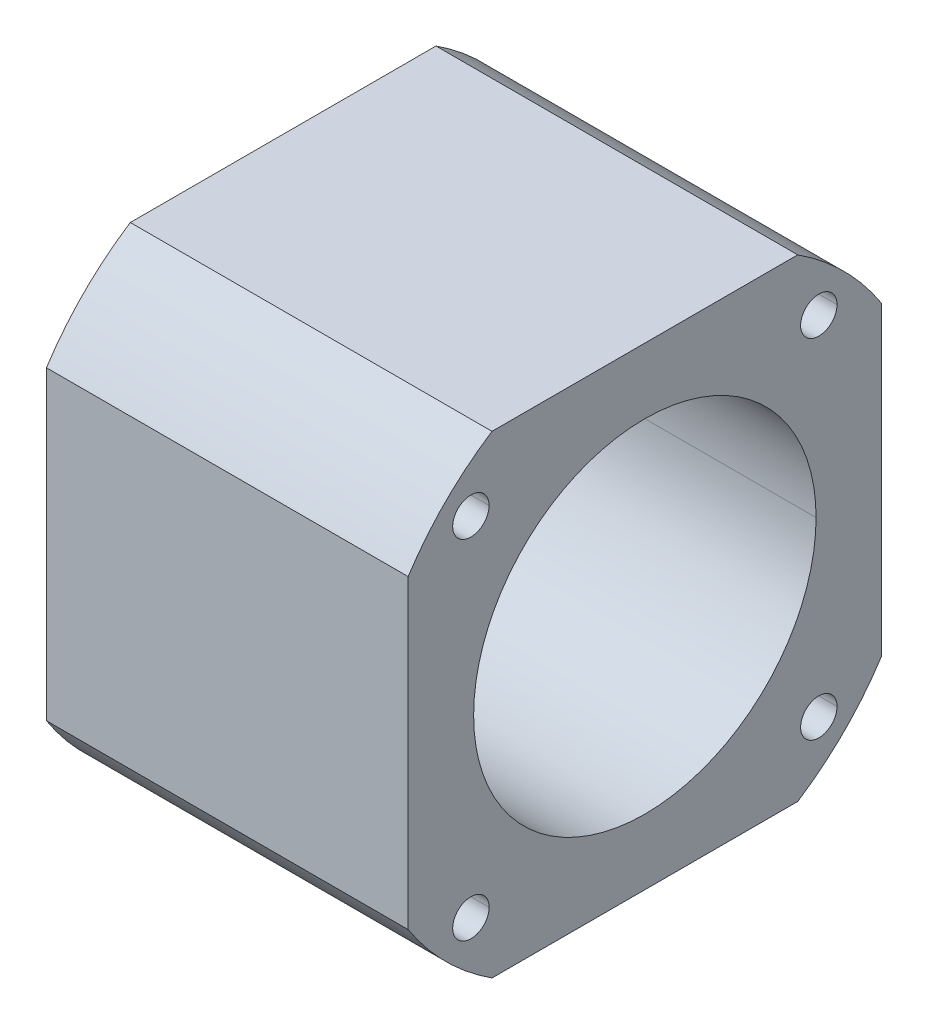
ISO-10303-21;
HEADER;
FILE_DESCRIPTION(('STEP AP214'),'2;1');
FILE_NAME('part.step','',(''),(''),'','','');
FILE_SCHEMA(('AUTOMOTIVE_DESIGN { 1 0 10303 214 1 1 1 1 }'));
ENDSEC;
DATA;
#1=APPLICATION_CONTEXT('core data for automotive mechanical design processes');
#2=APPLICATION_PROTOCOL_DEFINITION('international standard','automotive_design',2000,#1);
#3=PRODUCT_CONTEXT('',#1,'mechanical');
#4=PRODUCT('Part','Part','',(#3));
#5=PRODUCT_RELATED_PRODUCT_CATEGORY('part','',(#4));
#6=PRODUCT_DEFINITION_FORMATION('','',#4);
#7=PRODUCT_DEFINITION_CONTEXT('part definition',#1,'design');
#8=PRODUCT_DEFINITION('design','',#6,#7);
#9=PRODUCT_DEFINITION_SHAPE('','',#8);
#10=(LENGTH_UNIT() NAMED_UNIT(*) SI_UNIT(.MILLI.,.METRE.));
#11=(NAMED_UNIT(*) PLANE_ANGLE_UNIT() SI_UNIT($,.RADIAN.));
#12=(NAMED_UNIT(*) SI_UNIT($,.STERADIAN.) SOLID_ANGLE_UNIT());
#13=UNCERTAINTY_MEASURE_WITH_UNIT(LENGTH_MEASURE(1.E-05),#10,'distance_accuracy_value','');
#14=(GEOMETRIC_REPRESENTATION_CONTEXT(3) GLOBAL_UNCERTAINTY_ASSIGNED_CONTEXT((#13)) GLOBAL_UNIT_ASSIGNED_CONTEXT((#10,
#11,#12)) REPRESENTATION_CONTEXT('',''));
#15=CARTESIAN_POINT('',(0.,0.,0.));
#16=DIRECTION('',(0.,0.,1.));
#17=DIRECTION('',(1.,0.,0.));
#18=AXIS2_PLACEMENT_3D('',#15,#16,#17);
#19=CARTESIAN_POINT('',(21.1074,2.05287176147095E-11,2.05321870616615E-11));
#20=DIRECTION('',(1.,0.,0.));
#21=DIRECTION('',(0.,-0.707106781186548,-0.707106781186547));
#22=AXIS2_PLACEMENT_3D('',#19,#20,#21);
#23=CYLINDRICAL_SURFACE('',#22,25.0951999999714);
#24=CARTESIAN_POINT('',(11.1074,2.05287176147095E-11,2.05321870616615E-11));
#25=DIRECTION('',(-1.,0.,0.));
#26=DIRECTION('',(0.,-1.,0.));
#27=AXIS2_PLACEMENT_3D('',#24,#25,#26);
#28=CIRCLE('',#27,25.0951999999714);
#29=CARTESIAN_POINT('',(11.1074,21.082,13.613167854691));
#30=VERTEX_POINT('',#29);
#31=CARTESIAN_POINT('',(11.1074,13.613167854691,21.082));
#32=VERTEX_POINT('',#31);
#33=EDGE_CURVE('E51',#30,#32,#28,.F.);
#34=ORIENTED_EDGE('',*,*,#33,.F.);
#35=DIRECTION('',(-1.,0.,0.));
#36=VECTOR('',#35,1.);
#37=CARTESIAN_POINT('',(21.1074,21.082,13.613167854691));
#38=LINE('',#37,#36);
#39=CARTESIAN_POINT('',(-21.1074,21.082,13.613167854691));
#40=VERTEX_POINT('',#39);
#41=EDGE_CURVE('E37',#30,#40,#38,.T.);
#42=ORIENTED_EDGE('',*,*,#41,.T.);
#43=CARTESIAN_POINT('',(-21.1074,2.05287176147095E-11,2.05321870616615E-11));
#44=DIRECTION('',(1.,0.,0.));
#45=DIRECTION('',(0.,0.,-1.));
#46=AXIS2_PLACEMENT_3D('',#43,#44,#45);
#47=CIRCLE('',#46,25.0951999999714);
#48=CARTESIAN_POINT('',(-21.1074,13.613167854691,21.082));
#49=VERTEX_POINT('',#48);
#50=EDGE_CURVE('E43',#40,#49,#47,.T.);
#51=ORIENTED_EDGE('',*,*,#50,.T.);
#52=DIRECTION('',(-1.,0.,0.));
#53=VECTOR('',#52,1.);
#54=CARTESIAN_POINT('',(21.1074,13.613167854691,21.082));
#55=LINE('',#54,#53);
#56=EDGE_CURVE('E253',#32,#49,#55,.T.);
#57=ORIENTED_EDGE('',*,*,#56,.F.);
#58=EDGE_LOOP('',(#34,#42,#51,#57));
#59=FACE_BOUND('',#58,.T.);
#60=ADVANCED_FACE('F34',(#59),#23,.T.);
#61=CARTESIAN_POINT('',(21.1074,21.082,-13.613167854691));
#62=DIRECTION('',(0.,-1.,0.));
#63=DIRECTION('',(0.,0.,-1.));
#64=AXIS2_PLACEMENT_3D('',#61,#62,#63);
#65=PLANE('',#64);
#66=ORIENTED_EDGE('',*,*,#41,.F.);
#67=DIRECTION('',(0.,0.,1.));
#68=VECTOR('',#67,1.);
#69=CARTESIAN_POINT('',(11.1074,21.082,-21.08205));
#70=LINE('',#69,#68);
#71=CARTESIAN_POINT('',(11.1074,21.082,-13.613167854691));
#72=VERTEX_POINT('',#71);
#73=EDGE_CURVE('E195',#72,#30,#70,.T.);
#74=ORIENTED_EDGE('',*,*,#73,.F.);
#75=DIRECTION('',(-1.,0.,0.));
#76=VECTOR('',#75,1.);
#77=CARTESIAN_POINT('',(21.1074,21.082,-13.613167854691));
#78=LINE('',#77,#76);
#79=CARTESIAN_POINT('',(-21.1074,21.082,-13.613167854691));
#80=VERTEX_POINT('',#79);
#81=EDGE_CURVE('E239',#72,#80,#78,.T.);
#82=ORIENTED_EDGE('',*,*,#81,.T.);
#83=DIRECTION('',(0.,0.,1.));
#84=VECTOR('',#83,1.);
#85=CARTESIAN_POINT('',(-21.1074,21.082,-13.613167854691));
#86=LINE('',#85,#84);
#87=EDGE_CURVE('E241',#80,#40,#86,.T.);
#88=ORIENTED_EDGE('',*,*,#87,.T.);
#89=EDGE_LOOP('',(#66,#74,#82,#88));
#90=FACE_BOUND('',#89,.T.);
#91=ADVANCED_FACE('F810',(#90),#65,.F.);
#92=CARTESIAN_POINT('',(21.1074,2.05321870616615E-11,-2.05287176147095E-11));
#93=DIRECTION('',(1.,0.,0.));
#94=DIRECTION('',(0.,-0.707106781186547,0.707106781186548));
#95=AXIS2_PLACEMENT_3D('',#92,#93,#94);
#96=CYLINDRICAL_SURFACE('',#95,25.0951999999714);
#97=CARTESIAN_POINT('',(11.1074,2.05321870616615E-11,-2.05287176147095E-11));
#98=DIRECTION('',(-1.,0.,0.));
#99=DIRECTION('',(0.,-1.,0.));
#100=AXIS2_PLACEMENT_3D('',#97,#98,#99);
#101=CIRCLE('',#100,25.0951999999714);
#102=CARTESIAN_POINT('',(11.1074,13.613167854691,-21.082));
#103=VERTEX_POINT('',#102);
#104=EDGE_CURVE('E296',#103,#72,#101,.F.);
#105=ORIENTED_EDGE('',*,*,#104,.F.);
#106=DIRECTION('',(-1.,0.,0.));
#107=VECTOR('',#106,1.);
#108=CARTESIAN_POINT('',(21.1074,13.613167854691,-21.082));
#109=LINE('',#108,#107);
#110=CARTESIAN_POINT('',(-21.1074,13.613167854691,-21.082));
#111=VERTEX_POINT('',#110);
#112=EDGE_CURVE('E232',#103,#111,#109,.T.);
#113=ORIENTED_EDGE('',*,*,#112,.T.);
#114=CARTESIAN_POINT('',(-21.1074,2.05321870616615E-11,-2.05287176147095E-11));
#115=DIRECTION('',(1.,0.,0.));
#116=DIRECTION('',(0.,0.,-1.));
#117=AXIS2_PLACEMENT_3D('',#114,#115,#116);
#118=CIRCLE('',#117,25.0951999999714);
#119=EDGE_CURVE('E237',#111,#80,#118,.T.);
#120=ORIENTED_EDGE('',*,*,#119,.T.);
#121=ORIENTED_EDGE('',*,*,#81,.F.);
#122=EDGE_LOOP('',(#105,#113,#120,#121));
#123=FACE_BOUND('',#122,.T.);
#124=ADVANCED_FACE('F815',(#123),#96,.T.);
#125=CARTESIAN_POINT('',(21.1074,-13.613167854691,-21.082));
#126=DIRECTION('',(0.,0.,1.));
#127=DIRECTION('',(1.,0.,0.));
#128=AXIS2_PLACEMENT_3D('',#125,#126,#127);
#129=PLANE('',#128);
#130=ORIENTED_EDGE('',*,*,#112,.F.);
#131=DIRECTION('',(0.,-1.,0.));
#132=VECTOR('',#131,1.);
#133=CARTESIAN_POINT('',(11.1074,-13.613167854691,-21.082));
#134=LINE('',#133,#132);
#135=CARTESIAN_POINT('',(11.1074,-13.613167854691,-21.082));
#136=VERTEX_POINT('',#135);
#137=EDGE_CURVE('E204',#103,#136,#134,.T.);
#138=ORIENTED_EDGE('',*,*,#137,.T.);
#139=DIRECTION('',(-1.,0.,0.));
#140=VECTOR('',#139,1.);
#141=CARTESIAN_POINT('',(21.1074,-13.613167854691,-21.082));
#142=LINE('',#141,#140);
#143=CARTESIAN_POINT('',(-21.1074,-13.613167854691,-21.082));
#144=VERTEX_POINT('',#143);
#145=EDGE_CURVE('E203',#136,#144,#142,.T.);
#146=ORIENTED_EDGE('',*,*,#145,.T.);
#147=DIRECTION('',(0.,1.,0.));
#148=VECTOR('',#147,1.);
#149=CARTESIAN_POINT('',(-21.1074,-13.613167854691,-21.082));
#150=LINE('',#149,#148);
#151=EDGE_CURVE('E229',#144,#111,#150,.T.);
#152=ORIENTED_EDGE('',*,*,#151,.T.);
#153=EDGE_LOOP('',(#130,#138,#146,#152));
#154=FACE_BOUND('',#153,.T.);
#155=ADVANCED_FACE('F294',(#154),#129,.F.);
#156=CARTESIAN_POINT('',(21.1074,-2.05287176147095E-11,-2.05321870616615E-11));
#157=DIRECTION('',(1.,0.,0.));
#158=DIRECTION('',(0.,0.707106781186547,0.707106781186548));
#159=AXIS2_PLACEMENT_3D('',#156,#157,#158);
#160=CYLINDRICAL_SURFACE('',#159,25.0951999999714);
#161=CARTESIAN_POINT('',(11.1074,-2.05287176147095E-11,-2.05321870616615E-11));
#162=DIRECTION('',(-1.,0.,0.));
#163=DIRECTION('',(0.,-1.,0.));
#164=AXIS2_PLACEMENT_3D('',#161,#162,#163);
#165=CIRCLE('',#164,25.0951999999714);
#166=CARTESIAN_POINT('',(11.1074,-21.082,-13.613167854691));
#167=VERTEX_POINT('',#166);
#168=EDGE_CURVE('E187',#167,#136,#165,.F.);
#169=ORIENTED_EDGE('',*,*,#168,.F.);
#170=DIRECTION('',(-1.,0.,0.));
#171=VECTOR('',#170,1.);
#172=CARTESIAN_POINT('',(21.1074,-21.082,-13.613167854691));
#173=LINE('',#172,#171);
#174=CARTESIAN_POINT('',(-21.1074,-21.082,-13.613167854691));
#175=VERTEX_POINT('',#174);
#176=EDGE_CURVE('E201',#167,#175,#173,.T.);
#177=ORIENTED_EDGE('',*,*,#176,.T.);
#178=CARTESIAN_POINT('',(-21.1074,-2.05287176147095E-11,-2.05321870616615E-11));
#179=DIRECTION('',(1.,0.,0.));
#180=DIRECTION('',(0.,0.,-1.));
#181=AXIS2_PLACEMENT_3D('',#178,#179,#180);
#182=CIRCLE('',#181,25.0951999999714);
#183=EDGE_CURVE('E210',#175,#144,#182,.T.);
#184=ORIENTED_EDGE('',*,*,#183,.T.);
#185=ORIENTED_EDGE('',*,*,#145,.F.);
#186=EDGE_LOOP('',(#169,#177,#184,#185));
#187=FACE_BOUND('',#186,.T.);
#188=ADVANCED_FACE('F199',(#187),#160,.T.);
#189=CARTESIAN_POINT('',(21.1074,-21.082,13.613167854691));
#190=DIRECTION('',(0.,1.,0.));
#191=DIRECTION('',(0.,0.,1.));
#192=AXIS2_PLACEMENT_3D('',#189,#190,#191);
#193=PLANE('',#192);
#194=ORIENTED_EDGE('',*,*,#176,.F.);
#195=DIRECTION('',(0.,0.,1.));
#196=VECTOR('',#195,1.);
#197=CARTESIAN_POINT('',(11.1074,-21.082,-21.08205));
#198=LINE('',#197,#196);
#199=CARTESIAN_POINT('',(11.1074,-21.082,13.613167854691));
#200=VERTEX_POINT('',#199);
#201=EDGE_CURVE('E183',#167,#200,#198,.T.);
#202=ORIENTED_EDGE('',*,*,#201,.T.);
#203=DIRECTION('',(-1.,0.,0.));
#204=VECTOR('',#203,1.);
#205=CARTESIAN_POINT('',(21.1074,-21.082,13.613167854691));
#206=LINE('',#205,#204);
#207=CARTESIAN_POINT('',(-21.1074,-21.082,13.613167854691));
#208=VERTEX_POINT('',#207);
#209=EDGE_CURVE('E213',#200,#208,#206,.T.);
#210=ORIENTED_EDGE('',*,*,#209,.T.);
#211=DIRECTION('',(0.,0.,-1.));
#212=VECTOR('',#211,1.);
#213=CARTESIAN_POINT('',(-21.1074,-21.082,13.613167854691));
#214=LINE('',#213,#212);
#215=EDGE_CURVE('E208',#208,#175,#214,.T.);
#216=ORIENTED_EDGE('',*,*,#215,.T.);
#217=EDGE_LOOP('',(#194,#202,#210,#216));
#218=FACE_BOUND('',#217,.T.);
#219=ADVANCED_FACE('F206',(#218),#193,.F.);
#220=CARTESIAN_POINT('',(21.1074,-2.05321870616615E-11,2.05287176147095E-11));
#221=DIRECTION('',(1.,0.,0.));
#222=DIRECTION('',(0.,0.707106781186548,-0.707106781186547));
#223=AXIS2_PLACEMENT_3D('',#220,#221,#222);
#224=CYLINDRICAL_SURFACE('',#223,25.0951999999714);
#225=CARTESIAN_POINT('',(11.1074,-2.05321870616615E-11,2.05287176147095E-11));
#226=DIRECTION('',(-1.,0.,0.));
#227=DIRECTION('',(0.,-1.,0.));
#228=AXIS2_PLACEMENT_3D('',#225,#226,#227);
#229=CIRCLE('',#228,25.0951999999714);
#230=CARTESIAN_POINT('',(11.1074,-13.613167854691,21.082));
#231=VERTEX_POINT('',#230);
#232=EDGE_CURVE('E190',#231,#200,#229,.F.);
#233=ORIENTED_EDGE('',*,*,#232,.F.);
#234=DIRECTION('',(-1.,0.,0.));
#235=VECTOR('',#234,1.);
#236=CARTESIAN_POINT('',(21.1074,-13.613167854691,21.082));
#237=LINE('',#236,#235);
#238=CARTESIAN_POINT('',(-21.1074,-13.613167854691,21.082));
#239=VERTEX_POINT('',#238);
#240=EDGE_CURVE('E255',#231,#239,#237,.T.);
#241=ORIENTED_EDGE('',*,*,#240,.T.);
#242=CARTESIAN_POINT('',(-21.1074,-2.05321870616615E-11,2.05287176147095E-11));
#243=DIRECTION('',(1.,0.,0.));
#244=DIRECTION('',(0.,0.,-1.));
#245=AXIS2_PLACEMENT_3D('',#242,#243,#244);
#246=CIRCLE('',#245,25.0951999999714);
#247=EDGE_CURVE('E258',#239,#208,#246,.T.);
#248=ORIENTED_EDGE('',*,*,#247,.T.);
#249=ORIENTED_EDGE('',*,*,#209,.F.);
#250=EDGE_LOOP('',(#233,#241,#248,#249));
#251=FACE_BOUND('',#250,.T.);
#252=ADVANCED_FACE('F274',(#251),#224,.T.);
#253=CARTESIAN_POINT('',(21.1074,13.613167854691,21.082));
#254=DIRECTION('',(0.,0.,-1.));
#255=DIRECTION('',(-1.,0.,0.));
#256=AXIS2_PLACEMENT_3D('',#253,#254,#255);
#257=PLANE('',#256);
#258=ORIENTED_EDGE('',*,*,#240,.F.);
#259=DIRECTION('',(0.,1.,0.));
#260=VECTOR('',#259,1.);
#261=CARTESIAN_POINT('',(11.1074,13.613167854691,21.082));
#262=LINE('',#261,#260);
#263=EDGE_CURVE('E277',#231,#32,#262,.T.);
#264=ORIENTED_EDGE('',*,*,#263,.T.);
#265=ORIENTED_EDGE('',*,*,#56,.T.);
#266=DIRECTION('',(0.,-1.,0.));
#267=VECTOR('',#266,1.);
#268=CARTESIAN_POINT('',(-21.1074,13.613167854691,21.082));
#269=LINE('',#268,#267);
#270=EDGE_CURVE('E259',#49,#239,#269,.T.);
#271=ORIENTED_EDGE('',*,*,#270,.T.);
#272=EDGE_LOOP('',(#258,#264,#265,#271));
#273=FACE_BOUND('',#272,.T.);
#274=ADVANCED_FACE('F280',(#273),#257,.F.);
#275=CARTESIAN_POINT('',(-21.1074,-2.05321870616615E-11,2.05287176147095E-11));
#276=DIRECTION('',(1.,0.,0.));
#277=DIRECTION('',(0.,0.,-1.));
#278=AXIS2_PLACEMENT_3D('',#275,#276,#277);
#279=PLANE('',#278);
#280=CARTESIAN_POINT('',(-21.1074,15.494,-15.494));
#281=DIRECTION('',(1.,0.,0.));
#282=DIRECTION('',(0.,0.,-1.));
#283=AXIS2_PLACEMENT_3D('',#280,#281,#282);
#284=CIRCLE('',#283,2.);
#285=CARTESIAN_POINT('',(-21.1074,15.494,-17.494));
#286=VERTEX_POINT('',#285);
#287=CARTESIAN_POINT('',(-21.1074,15.494,-13.494));
#288=VERTEX_POINT('',#287);
#289=EDGE_CURVE('E286',#286,#288,#284,.T.);
#290=ORIENTED_EDGE('',*,*,#289,.T.);
#291=CARTESIAN_POINT('',(-21.1074,15.494,-15.494));
#292=DIRECTION('',(1.,0.,0.));
#293=DIRECTION('',(0.,0.,-1.));
#294=AXIS2_PLACEMENT_3D('',#291,#292,#293);
#295=CIRCLE('',#294,2.);
#296=EDGE_CURVE('E653',#288,#286,#295,.T.);
#297=ORIENTED_EDGE('',*,*,#296,.T.);
#298=EDGE_LOOP('',(#290,#297));
#299=FACE_BOUND('',#298,.T.);
#300=CARTESIAN_POINT('',(-21.1074,15.494,15.494));
#301=DIRECTION('',(1.,0.,0.));
#302=DIRECTION('',(0.,0.,-1.));
#303=AXIS2_PLACEMENT_3D('',#300,#301,#302);
#304=CIRCLE('',#303,2.);
#305=CARTESIAN_POINT('',(-21.1074,15.494,13.494));
#306=VERTEX_POINT('',#305);
#307=CARTESIAN_POINT('',(-21.1074,15.494,17.494));
#308=VERTEX_POINT('',#307);
#309=EDGE_CURVE('E649',#306,#308,#304,.T.);
#310=ORIENTED_EDGE('',*,*,#309,.T.);
#311=CARTESIAN_POINT('',(-21.1074,15.494,15.494));
#312=DIRECTION('',(1.,0.,0.));
#313=DIRECTION('',(0.,0.,-1.));
#314=AXIS2_PLACEMENT_3D('',#311,#312,#313);
#315=CIRCLE('',#314,2.);
#316=EDGE_CURVE('E645',#308,#306,#315,.T.);
#317=ORIENTED_EDGE('',*,*,#316,.T.);
#318=EDGE_LOOP('',(#310,#317));
#319=FACE_BOUND('',#318,.T.);
#320=CARTESIAN_POINT('',(-21.1074,-15.494,-15.494));
#321=DIRECTION('',(1.,0.,0.));
#322=DIRECTION('',(0.,0.,-1.));
#323=AXIS2_PLACEMENT_3D('',#320,#321,#322);
#324=CIRCLE('',#323,2.);
#325=CARTESIAN_POINT('',(-21.1074,-15.494,-17.494));
#326=VERTEX_POINT('',#325);
#327=CARTESIAN_POINT('',(-21.1074,-15.494,-13.494));
#328=VERTEX_POINT('',#327);
#329=EDGE_CURVE('E641',#326,#328,#324,.T.);
#330=ORIENTED_EDGE('',*,*,#329,.T.);
#331=CARTESIAN_POINT('',(-21.1074,-15.494,-15.494));
#332=DIRECTION('',(1.,0.,0.));
#333=DIRECTION('',(0.,0.,-1.));
#334=AXIS2_PLACEMENT_3D('',#331,#332,#333);
#335=CIRCLE('',#334,2.);
#336=EDGE_CURVE('E637',#328,#326,#335,.T.);
#337=ORIENTED_EDGE('',*,*,#336,.T.);
#338=EDGE_LOOP('',(#330,#337));
#339=FACE_BOUND('',#338,.T.);
#340=CARTESIAN_POINT('',(-21.1074,-15.494,15.494));
#341=DIRECTION('',(1.,0.,0.));
#342=DIRECTION('',(0.,0.,-1.));
#343=AXIS2_PLACEMENT_3D('',#340,#341,#342);
#344=CIRCLE('',#343,2.);
#345=CARTESIAN_POINT('',(-21.1074,-15.494,13.494));
#346=VERTEX_POINT('',#345);
#347=CARTESIAN_POINT('',(-21.1074,-15.494,17.494));
#348=VERTEX_POINT('',#347);
#349=EDGE_CURVE('E633',#346,#348,#344,.T.);
#350=ORIENTED_EDGE('',*,*,#349,.T.);
#351=CARTESIAN_POINT('',(-21.1074,-15.494,15.494));
#352=DIRECTION('',(1.,0.,0.));
#353=DIRECTION('',(0.,0.,-1.));
#354=AXIS2_PLACEMENT_3D('',#351,#352,#353);
#355=CIRCLE('',#354,2.);
#356=EDGE_CURVE('E629',#348,#346,#355,.T.);
#357=ORIENTED_EDGE('',*,*,#356,.T.);
#358=EDGE_LOOP('',(#350,#357));
#359=FACE_BOUND('',#358,.T.);
#360=CARTESIAN_POINT('',(-21.1074,0.,0.));
#361=DIRECTION('',(1.,0.,0.));
#362=DIRECTION('',(0.,0.,-1.));
#363=AXIS2_PLACEMENT_3D('',#360,#361,#362);
#364=CIRCLE('',#363,15.25);
#365=CARTESIAN_POINT('',(-21.1074,0.,-15.25));
#366=VERTEX_POINT('',#365);
#367=CARTESIAN_POINT('',(-21.1074,0.,15.25));
#368=VERTEX_POINT('',#367);
#369=EDGE_CURVE('E625',#366,#368,#364,.T.);
#370=ORIENTED_EDGE('',*,*,#369,.T.);
#371=CARTESIAN_POINT('',(-21.1074,0.,0.));
#372=DIRECTION('',(1.,0.,0.));
#373=DIRECTION('',(0.,0.,-1.));
#374=AXIS2_PLACEMENT_3D('',#371,#372,#373);
#375=CIRCLE('',#374,15.25);
#376=EDGE_CURVE('E623',#368,#366,#375,.T.);
#377=ORIENTED_EDGE('',*,*,#376,.T.);
#378=EDGE_LOOP('',(#370,#377));
#379=FACE_BOUND('',#378,.T.);
#380=ORIENTED_EDGE('',*,*,#270,.F.);
#381=ORIENTED_EDGE('',*,*,#50,.F.);
#382=ORIENTED_EDGE('',*,*,#87,.F.);
#383=ORIENTED_EDGE('',*,*,#119,.F.);
#384=ORIENTED_EDGE('',*,*,#151,.F.);
#385=ORIENTED_EDGE('',*,*,#183,.F.);
#386=ORIENTED_EDGE('',*,*,#215,.F.);
#387=ORIENTED_EDGE('',*,*,#247,.F.);
#388=EDGE_LOOP('',(#380,#381,#382,#383,#384,#385,#386,#387));
#389=FACE_BOUND('',#388,.T.);
#390=ADVANCED_FACE('F287',(#299,#319,#339,#359,#379,#389),#279,.F.);
#391=CARTESIAN_POINT('',(21.1074,0.,0.));
#392=DIRECTION('',(1.,0.,0.));
#393=DIRECTION('',(0.,1.,0.));
#394=AXIS2_PLACEMENT_3D('',#391,#392,#393);
#395=CYLINDRICAL_SURFACE('',#394,15.25);
#396=CARTESIAN_POINT('',(-21.1074,0.,15.25));
#397=DIRECTION('',(1.,0.,0.));
#398=VECTOR('',#397,1.);
#399=LINE('',#396,#398);
#400=CARTESIAN_POINT('',(11.1074,0.,15.25));
#401=VERTEX_POINT('',#400);
#402=EDGE_CURVE('E600',#368,#401,#399,.T.);
#403=ORIENTED_EDGE('',*,*,#402,.T.);
#404=CARTESIAN_POINT('',(11.1074,0.,0.));
#405=DIRECTION('',(-1.,0.,0.));
#406=DIRECTION('',(0.,-1.,0.));
#407=AXIS2_PLACEMENT_3D('',#404,#405,#406);
#408=CIRCLE('',#407,15.25);
#409=CARTESIAN_POINT('',(11.1074,0.,-15.25));
#410=VERTEX_POINT('',#409);
#411=EDGE_CURVE('E58',#401,#410,#408,.F.);
#412=ORIENTED_EDGE('',*,*,#411,.T.);
#413=CARTESIAN_POINT('',(-21.1074,0.,-15.25));
#414=DIRECTION('',(1.,0.,0.));
#415=VECTOR('',#414,1.);
#416=LINE('',#413,#415);
#417=EDGE_CURVE('E613',#366,#410,#416,.T.);
#418=ORIENTED_EDGE('',*,*,#417,.F.);
#419=ORIENTED_EDGE('',*,*,#376,.F.);
#420=EDGE_LOOP('',(#403,#412,#418,#419));
#421=FACE_BOUND('',#420,.T.);
#422=ADVANCED_FACE('F583',(#421),#395,.F.);
#423=CARTESIAN_POINT('',(21.1074,0.,0.));
#424=DIRECTION('',(1.,0.,0.));
#425=DIRECTION('',(0.,-1.,0.));
#426=AXIS2_PLACEMENT_3D('',#423,#424,#425);
#427=CYLINDRICAL_SURFACE('',#426,15.25);
#428=ORIENTED_EDGE('',*,*,#417,.T.);
#429=CARTESIAN_POINT('',(11.1074,0.,0.));
#430=DIRECTION('',(-1.,0.,0.));
#431=DIRECTION('',(0.,-1.,0.));
#432=AXIS2_PLACEMENT_3D('',#429,#430,#431);
#433=CIRCLE('',#432,15.25);
#434=EDGE_CURVE('E846',#410,#401,#433,.F.);
#435=ORIENTED_EDGE('',*,*,#434,.T.);
#436=ORIENTED_EDGE('',*,*,#402,.F.);
#437=ORIENTED_EDGE('',*,*,#369,.F.);
#438=EDGE_LOOP('',(#428,#435,#436,#437));
#439=FACE_BOUND('',#438,.T.);
#440=ADVANCED_FACE('F574',(#439),#427,.F.);
#441=CARTESIAN_POINT('',(-21.1074,-15.494,15.494));
#442=DIRECTION('',(-1.,0.,0.));
#443=DIRECTION('',(0.,1.,0.));
#444=AXIS2_PLACEMENT_3D('',#441,#442,#443);
#445=CONICAL_SURFACE('',#444,2.,0.785398163397451);
#446=ORIENTED_EDGE('',*,*,#356,.F.);
#447=CARTESIAN_POINT('',(-20.7284,-15.494,17.115));
#448=DIRECTION('',(-0.707106781186544,0.,0.707106781186551));
#449=VECTOR('',#448,1.);
#450=LINE('',#447,#449);
#451=CARTESIAN_POINT('',(-20.7284,-15.494,17.115));
#452=VERTEX_POINT('',#451);
#453=EDGE_CURVE('E537',#452,#348,#450,.T.);
#454=ORIENTED_EDGE('',*,*,#453,.F.);
#455=CARTESIAN_POINT('',(-20.7284,-15.494,15.494));
#456=DIRECTION('',(1.,0.,0.));
#457=DIRECTION('',(0.,0.,-1.));
#458=AXIS2_PLACEMENT_3D('',#455,#456,#457);
#459=CIRCLE('',#458,1.621);
#460=CARTESIAN_POINT('',(-20.7284,-15.494,13.873));
#461=VERTEX_POINT('',#460);
#462=EDGE_CURVE('E556',#452,#461,#459,.T.);
#463=ORIENTED_EDGE('',*,*,#462,.T.);
#464=CARTESIAN_POINT('',(-20.7284,-15.494,13.873));
#465=DIRECTION('',(-0.707106781186544,0.,-0.707106781186551));
#466=VECTOR('',#465,1.);
#467=LINE('',#464,#466);
#468=EDGE_CURVE('E540',#461,#346,#467,.T.);
#469=ORIENTED_EDGE('',*,*,#468,.T.);
#470=EDGE_LOOP('',(#446,#454,#463,#469));
#471=FACE_BOUND('',#470,.T.);
#472=ADVANCED_FACE('F518',(#471),#445,.F.);
#473=CARTESIAN_POINT('',(-21.1074,-15.494,15.494));
#474=DIRECTION('',(-1.,0.,0.));
#475=DIRECTION('',(0.,-1.,0.));
#476=AXIS2_PLACEMENT_3D('',#473,#474,#475);
#477=CONICAL_SURFACE('',#476,2.,0.785398163397451);
#478=CARTESIAN_POINT('',(-20.7284,-15.494,15.494));
#479=DIRECTION('',(1.,0.,0.));
#480=DIRECTION('',(0.,0.,-1.));
#481=AXIS2_PLACEMENT_3D('',#478,#479,#480);
#482=CIRCLE('',#481,1.621);
#483=EDGE_CURVE('E538',#461,#452,#482,.T.);
#484=ORIENTED_EDGE('',*,*,#483,.T.);
#485=ORIENTED_EDGE('',*,*,#453,.T.);
#486=ORIENTED_EDGE('',*,*,#349,.F.);
#487=ORIENTED_EDGE('',*,*,#468,.F.);
#488=EDGE_LOOP('',(#484,#485,#486,#487));
#489=FACE_BOUND('',#488,.T.);
#490=ADVANCED_FACE('F512',(#489),#477,.F.);
#491=CARTESIAN_POINT('',(21.1074,-15.494,15.494));
#492=DIRECTION('',(-1.,0.,0.));
#493=DIRECTION('',(0.,-1.,0.));
#494=AXIS2_PLACEMENT_3D('',#491,#492,#493);
#495=CYLINDRICAL_SURFACE('',#494,1.621);
#496=CARTESIAN_POINT('',(11.1074,-15.494,13.873));
#497=DIRECTION('',(-1.,0.,0.));
#498=VECTOR('',#497,1.);
#499=LINE('',#496,#498);
#500=CARTESIAN_POINT('',(11.1074,-15.494,13.873));
#501=VERTEX_POINT('',#500);
#502=EDGE_CURVE('E801',#501,#461,#499,.T.);
#503=ORIENTED_EDGE('',*,*,#502,.F.);
#504=CARTESIAN_POINT('',(11.1074,-15.494,15.494));
#505=DIRECTION('',(-1.,0.,0.));
#506=DIRECTION('',(0.,-1.,0.));
#507=AXIS2_PLACEMENT_3D('',#504,#505,#506);
#508=CIRCLE('',#507,1.621);
#509=CARTESIAN_POINT('',(11.1074,-15.494,17.115));
#510=VERTEX_POINT('',#509);
#511=EDGE_CURVE('E842',#501,#510,#508,.F.);
#512=ORIENTED_EDGE('',*,*,#511,.T.);
#513=CARTESIAN_POINT('',(11.1074,-15.494,17.115));
#514=DIRECTION('',(-1.,0.,0.));
#515=VECTOR('',#514,1.);
#516=LINE('',#513,#515);
#517=EDGE_CURVE('E489',#510,#452,#516,.T.);
#518=ORIENTED_EDGE('',*,*,#517,.T.);
#519=ORIENTED_EDGE('',*,*,#483,.F.);
#520=EDGE_LOOP('',(#503,#512,#518,#519));
#521=FACE_BOUND('',#520,.T.);
#522=ADVANCED_FACE('F502',(#521),#495,.F.);
#523=CARTESIAN_POINT('',(21.1074,-15.494,15.494));
#524=DIRECTION('',(-1.,0.,0.));
#525=DIRECTION('',(0.,1.,0.));
#526=AXIS2_PLACEMENT_3D('',#523,#524,#525);
#527=CYLINDRICAL_SURFACE('',#526,1.621);
#528=ORIENTED_EDGE('',*,*,#517,.F.);
#529=CARTESIAN_POINT('',(11.1074,-15.494,15.494));
#530=DIRECTION('',(-1.,0.,0.));
#531=DIRECTION('',(0.,-1.,0.));
#532=AXIS2_PLACEMENT_3D('',#529,#530,#531);
#533=CIRCLE('',#532,1.621);
#534=EDGE_CURVE('E802',#510,#501,#533,.F.);
#535=ORIENTED_EDGE('',*,*,#534,.T.);
#536=ORIENTED_EDGE('',*,*,#502,.T.);
#537=ORIENTED_EDGE('',*,*,#462,.F.);
#538=EDGE_LOOP('',(#528,#535,#536,#537));
#539=FACE_BOUND('',#538,.T.);
#540=ADVANCED_FACE('F511',(#539),#527,.F.);
#541=CARTESIAN_POINT('',(-21.1074,-15.494,-15.494));
#542=DIRECTION('',(-1.,0.,0.));
#543=DIRECTION('',(0.,1.,0.));
#544=AXIS2_PLACEMENT_3D('',#541,#542,#543);
#545=CONICAL_SURFACE('',#544,2.,0.785398163397451);
#546=ORIENTED_EDGE('',*,*,#336,.F.);
#547=CARTESIAN_POINT('',(-20.7284,-15.494,-13.873));
#548=DIRECTION('',(-0.707106781186544,0.,0.707106781186551));
#549=VECTOR('',#548,1.);
#550=LINE('',#547,#549);
#551=CARTESIAN_POINT('',(-20.7284,-15.494,-13.873));
#552=VERTEX_POINT('',#551);
#553=EDGE_CURVE('E749',#552,#328,#550,.T.);
#554=ORIENTED_EDGE('',*,*,#553,.F.);
#555=CARTESIAN_POINT('',(-20.7284,-15.494,-15.494));
#556=DIRECTION('',(1.,0.,0.));
#557=DIRECTION('',(0.,0.,-1.));
#558=AXIS2_PLACEMENT_3D('',#555,#556,#557);
#559=CIRCLE('',#558,1.621);
#560=CARTESIAN_POINT('',(-20.7284,-15.494,-17.115));
#561=VERTEX_POINT('',#560);
#562=EDGE_CURVE('E736',#552,#561,#559,.T.);
#563=ORIENTED_EDGE('',*,*,#562,.T.);
#564=CARTESIAN_POINT('',(-20.7284,-15.494,-17.115));
#565=DIRECTION('',(-0.707106781186544,0.,-0.707106781186551));
#566=VECTOR('',#565,1.);
#567=LINE('',#564,#566);
#568=EDGE_CURVE('E739',#561,#326,#567,.T.);
#569=ORIENTED_EDGE('',*,*,#568,.T.);
#570=EDGE_LOOP('',(#546,#554,#563,#569));
#571=FACE_BOUND('',#570,.T.);
#572=ADVANCED_FACE('F745',(#571),#545,.F.);
#573=CARTESIAN_POINT('',(-21.1074,-15.494,-15.494));
#574=DIRECTION('',(-1.,0.,0.));
#575=DIRECTION('',(0.,-1.,0.));
#576=AXIS2_PLACEMENT_3D('',#573,#574,#575);
#577=CONICAL_SURFACE('',#576,2.,0.785398163397451);
#578=CARTESIAN_POINT('',(-20.7284,-15.494,-15.494));
#579=DIRECTION('',(1.,0.,0.));
#580=DIRECTION('',(0.,0.,-1.));
#581=AXIS2_PLACEMENT_3D('',#578,#579,#580);
#582=CIRCLE('',#581,1.621);
#583=EDGE_CURVE('E737',#561,#552,#582,.T.);
#584=ORIENTED_EDGE('',*,*,#583,.T.);
#585=ORIENTED_EDGE('',*,*,#553,.T.);
#586=ORIENTED_EDGE('',*,*,#329,.F.);
#587=ORIENTED_EDGE('',*,*,#568,.F.);
#588=EDGE_LOOP('',(#584,#585,#586,#587));
#589=FACE_BOUND('',#588,.T.);
#590=ADVANCED_FACE('F460',(#589),#577,.F.);
#591=CARTESIAN_POINT('',(21.1074,-15.494,-15.494));
#592=DIRECTION('',(-1.,0.,0.));
#593=DIRECTION('',(0.,-1.,0.));
#594=AXIS2_PLACEMENT_3D('',#591,#592,#593);
#595=CYLINDRICAL_SURFACE('',#594,1.621);
#596=CARTESIAN_POINT('',(11.1074,-15.494,-17.115));
#597=DIRECTION('',(-1.,0.,0.));
#598=VECTOR('',#597,1.);
#599=LINE('',#596,#598);
#600=CARTESIAN_POINT('',(11.1074,-15.494,-17.115));
#601=VERTEX_POINT('',#600);
#602=EDGE_CURVE('E481',#601,#561,#599,.T.);
#603=ORIENTED_EDGE('',*,*,#602,.F.);
#604=CARTESIAN_POINT('',(11.1074,-15.494,-15.494));
#605=DIRECTION('',(-1.,0.,0.));
#606=DIRECTION('',(0.,-1.,0.));
#607=AXIS2_PLACEMENT_3D('',#604,#605,#606);
#608=CIRCLE('',#607,1.621);
#609=CARTESIAN_POINT('',(11.1074,-15.494,-13.873));
#610=VERTEX_POINT('',#609);
#611=EDGE_CURVE('E835',#601,#610,#608,.F.);
#612=ORIENTED_EDGE('',*,*,#611,.T.);
#613=CARTESIAN_POINT('',(11.1074,-15.494,-13.873));
#614=DIRECTION('',(-1.,0.,0.));
#615=VECTOR('',#614,1.);
#616=LINE('',#613,#615);
#617=EDGE_CURVE('E730',#610,#552,#616,.T.);
#618=ORIENTED_EDGE('',*,*,#617,.T.);
#619=ORIENTED_EDGE('',*,*,#583,.F.);
#620=EDGE_LOOP('',(#603,#612,#618,#619));
#621=FACE_BOUND('',#620,.T.);
#622=ADVANCED_FACE('F454',(#621),#595,.F.);
#623=CARTESIAN_POINT('',(21.1074,-15.494,-15.494));
#624=DIRECTION('',(-1.,0.,0.));
#625=DIRECTION('',(0.,1.,0.));
#626=AXIS2_PLACEMENT_3D('',#623,#624,#625);
#627=CYLINDRICAL_SURFACE('',#626,1.621);
#628=ORIENTED_EDGE('',*,*,#617,.F.);
#629=CARTESIAN_POINT('',(11.1074,-15.494,-15.494));
#630=DIRECTION('',(-1.,0.,0.));
#631=DIRECTION('',(0.,-1.,0.));
#632=AXIS2_PLACEMENT_3D('',#629,#630,#631);
#633=CIRCLE('',#632,1.621);
#634=EDGE_CURVE('E734',#610,#601,#633,.F.);
#635=ORIENTED_EDGE('',*,*,#634,.T.);
#636=ORIENTED_EDGE('',*,*,#602,.T.);
#637=ORIENTED_EDGE('',*,*,#562,.F.);
#638=EDGE_LOOP('',(#628,#635,#636,#637));
#639=FACE_BOUND('',#638,.T.);
#640=ADVANCED_FACE('F445',(#639),#627,.F.);
#641=CARTESIAN_POINT('',(-21.1074,15.494,15.494));
#642=DIRECTION('',(-1.,0.,0.));
#643=DIRECTION('',(0.,1.,0.));
#644=AXIS2_PLACEMENT_3D('',#641,#642,#643);
#645=CONICAL_SURFACE('',#644,2.,0.785398163397451);
#646=ORIENTED_EDGE('',*,*,#316,.F.);
#647=CARTESIAN_POINT('',(-20.7284,15.494,17.115));
#648=DIRECTION('',(-0.707106781186544,0.,0.707106781186551));
#649=VECTOR('',#648,1.);
#650=LINE('',#647,#649);
#651=CARTESIAN_POINT('',(-20.7284,15.494,17.115));
#652=VERTEX_POINT('',#651);
#653=EDGE_CURVE('E406',#652,#308,#650,.T.);
#654=ORIENTED_EDGE('',*,*,#653,.F.);
#655=CARTESIAN_POINT('',(-20.7284,15.494,15.494));
#656=DIRECTION('',(1.,0.,0.));
#657=DIRECTION('',(0.,0.,-1.));
#658=AXIS2_PLACEMENT_3D('',#655,#656,#657);
#659=CIRCLE('',#658,1.621);
#660=CARTESIAN_POINT('',(-20.7284,15.494,13.873));
#661=VERTEX_POINT('',#660);
#662=EDGE_CURVE('E425',#652,#661,#659,.T.);
#663=ORIENTED_EDGE('',*,*,#662,.T.);
#664=CARTESIAN_POINT('',(-20.7284,15.494,13.873));
#665=DIRECTION('',(-0.707106781186544,0.,-0.707106781186551));
#666=VECTOR('',#665,1.);
#667=LINE('',#664,#666);
#668=EDGE_CURVE('E409',#661,#306,#667,.T.);
#669=ORIENTED_EDGE('',*,*,#668,.T.);
#670=EDGE_LOOP('',(#646,#654,#663,#669));
#671=FACE_BOUND('',#670,.T.);
#672=ADVANCED_FACE('F387',(#671),#645,.F.);
#673=CARTESIAN_POINT('',(-21.1074,15.494,15.494));
#674=DIRECTION('',(-1.,0.,0.));
#675=DIRECTION('',(0.,-1.,0.));
#676=AXIS2_PLACEMENT_3D('',#673,#674,#675);
#677=CONICAL_SURFACE('',#676,2.,0.785398163397451);
#678=CARTESIAN_POINT('',(-20.7284,15.494,15.494));
#679=DIRECTION('',(1.,0.,0.));
#680=DIRECTION('',(0.,0.,-1.));
#681=AXIS2_PLACEMENT_3D('',#678,#679,#680);
#682=CIRCLE('',#681,1.621);
#683=EDGE_CURVE('E407',#661,#652,#682,.T.);
#684=ORIENTED_EDGE('',*,*,#683,.T.);
#685=ORIENTED_EDGE('',*,*,#653,.T.);
#686=ORIENTED_EDGE('',*,*,#309,.F.);
#687=ORIENTED_EDGE('',*,*,#668,.F.);
#688=EDGE_LOOP('',(#684,#685,#686,#687));
#689=FACE_BOUND('',#688,.T.);
#690=ADVANCED_FACE('F381',(#689),#677,.F.);
#691=CARTESIAN_POINT('',(21.1074,15.494,15.494));
#692=DIRECTION('',(-1.,0.,0.));
#693=DIRECTION('',(0.,-1.,0.));
#694=AXIS2_PLACEMENT_3D('',#691,#692,#693);
#695=CYLINDRICAL_SURFACE('',#694,1.621);
#696=CARTESIAN_POINT('',(11.1074,15.494,13.873));
#697=DIRECTION('',(-1.,0.,0.));
#698=VECTOR('',#697,1.);
#699=LINE('',#696,#698);
#700=CARTESIAN_POINT('',(11.1074,15.494,13.873));
#701=VERTEX_POINT('',#700);
#702=EDGE_CURVE('E681',#701,#661,#699,.T.);
#703=ORIENTED_EDGE('',*,*,#702,.F.);
#704=CARTESIAN_POINT('',(11.1074,15.494,15.494));
#705=DIRECTION('',(-1.,0.,0.));
#706=DIRECTION('',(0.,-1.,0.));
#707=AXIS2_PLACEMENT_3D('',#704,#705,#706);
#708=CIRCLE('',#707,1.621);
#709=CARTESIAN_POINT('',(11.1074,15.494,17.115));
#710=VERTEX_POINT('',#709);
#711=EDGE_CURVE('E828',#701,#710,#708,.F.);
#712=ORIENTED_EDGE('',*,*,#711,.T.);
#713=CARTESIAN_POINT('',(11.1074,15.494,17.115));
#714=DIRECTION('',(-1.,0.,0.));
#715=VECTOR('',#714,1.);
#716=LINE('',#713,#715);
#717=EDGE_CURVE('E356',#710,#652,#716,.T.);
#718=ORIENTED_EDGE('',*,*,#717,.T.);
#719=ORIENTED_EDGE('',*,*,#683,.F.);
#720=EDGE_LOOP('',(#703,#712,#718,#719));
#721=FACE_BOUND('',#720,.T.);
#722=ADVANCED_FACE('F371',(#721),#695,.F.);
#723=CARTESIAN_POINT('',(21.1074,15.494,15.494));
#724=DIRECTION('',(-1.,0.,0.));
#725=DIRECTION('',(0.,1.,0.));
#726=AXIS2_PLACEMENT_3D('',#723,#724,#725);
#727=CYLINDRICAL_SURFACE('',#726,1.621);
#728=ORIENTED_EDGE('',*,*,#717,.F.);
#729=CARTESIAN_POINT('',(11.1074,15.494,15.494));
#730=DIRECTION('',(-1.,0.,0.));
#731=DIRECTION('',(0.,-1.,0.));
#732=AXIS2_PLACEMENT_3D('',#729,#730,#731);
#733=CIRCLE('',#732,1.621);
#734=EDGE_CURVE('E824',#710,#701,#733,.F.);
#735=ORIENTED_EDGE('',*,*,#734,.T.);
#736=ORIENTED_EDGE('',*,*,#702,.T.);
#737=ORIENTED_EDGE('',*,*,#662,.F.);
#738=EDGE_LOOP('',(#728,#735,#736,#737));
#739=FACE_BOUND('',#738,.T.);
#740=ADVANCED_FACE('F380',(#739),#727,.F.);
#741=CARTESIAN_POINT('',(-21.1074,15.494,-15.494));
#742=DIRECTION('',(-1.,0.,0.));
#743=DIRECTION('',(0.,1.,0.));
#744=AXIS2_PLACEMENT_3D('',#741,#742,#743);
#745=CONICAL_SURFACE('',#744,2.,0.785398163397451);
#746=ORIENTED_EDGE('',*,*,#296,.F.);
#747=CARTESIAN_POINT('',(-20.7284,15.494,-13.873));
#748=DIRECTION('',(-0.707106781186544,0.,0.707106781186551));
#749=VECTOR('',#748,1.);
#750=LINE('',#747,#749);
#751=CARTESIAN_POINT('',(-20.7284,15.494,-13.873));
#752=VERTEX_POINT('',#751);
#753=EDGE_CURVE('E673',#752,#288,#750,.T.);
#754=ORIENTED_EDGE('',*,*,#753,.F.);
#755=CARTESIAN_POINT('',(-20.7284,15.494,-15.494));
#756=DIRECTION('',(1.,0.,0.));
#757=DIRECTION('',(0.,0.,-1.));
#758=AXIS2_PLACEMENT_3D('',#755,#756,#757);
#759=CIRCLE('',#758,1.621);
#760=CARTESIAN_POINT('',(-20.7284,15.494,-17.115));
#761=VERTEX_POINT('',#760);
#762=EDGE_CURVE('E682',#752,#761,#759,.T.);
#763=ORIENTED_EDGE('',*,*,#762,.T.);
#764=CARTESIAN_POINT('',(-20.7284,15.494,-17.115));
#765=DIRECTION('',(-0.707106781186544,0.,-0.707106781186551));
#766=VECTOR('',#765,1.);
#767=LINE('',#764,#766);
#768=EDGE_CURVE('E676',#761,#286,#767,.T.);
#769=ORIENTED_EDGE('',*,*,#768,.T.);
#770=EDGE_LOOP('',(#746,#754,#763,#769));
#771=FACE_BOUND('',#770,.T.);
#772=ADVANCED_FACE('F671',(#771),#745,.F.);
#773=CARTESIAN_POINT('',(-21.1074,15.494,-15.494));
#774=DIRECTION('',(-1.,0.,0.));
#775=DIRECTION('',(0.,-1.,0.));
#776=AXIS2_PLACEMENT_3D('',#773,#774,#775);
#777=CONICAL_SURFACE('',#776,2.,0.785398163397451);
#778=CARTESIAN_POINT('',(-20.7284,15.494,-15.494));
#779=DIRECTION('',(1.,0.,0.));
#780=DIRECTION('',(0.,0.,-1.));
#781=AXIS2_PLACEMENT_3D('',#778,#779,#780);
#782=CIRCLE('',#781,1.621);
#783=EDGE_CURVE('E679',#761,#752,#782,.T.);
#784=ORIENTED_EDGE('',*,*,#783,.T.);
#785=ORIENTED_EDGE('',*,*,#753,.T.);
#786=ORIENTED_EDGE('',*,*,#289,.F.);
#787=ORIENTED_EDGE('',*,*,#768,.F.);
#788=EDGE_LOOP('',(#784,#785,#786,#787));
#789=FACE_BOUND('',#788,.T.);
#790=ADVANCED_FACE('F326',(#789),#777,.F.);
#791=CARTESIAN_POINT('',(21.1074,15.494,-15.494));
#792=DIRECTION('',(-1.,0.,0.));
#793=DIRECTION('',(0.,-1.,0.));
#794=AXIS2_PLACEMENT_3D('',#791,#792,#793);
#795=CYLINDRICAL_SURFACE('',#794,1.621);
#796=CARTESIAN_POINT('',(11.1074,15.494,-17.115));
#797=DIRECTION('',(-1.,0.,0.));
#798=VECTOR('',#797,1.);
#799=LINE('',#796,#798);
#800=CARTESIAN_POINT('',(11.1074,15.494,-17.115));
#801=VERTEX_POINT('',#800);
#802=EDGE_CURVE('E298',#801,#761,#799,.T.);
#803=ORIENTED_EDGE('',*,*,#802,.F.);
#804=CARTESIAN_POINT('',(11.1074,15.494,-15.494));
#805=DIRECTION('',(-1.,0.,0.));
#806=DIRECTION('',(0.,-1.,0.));
#807=AXIS2_PLACEMENT_3D('',#804,#805,#806);
#808=CIRCLE('',#807,1.621);
#809=CARTESIAN_POINT('',(11.1074,15.494,-13.873));
#810=VERTEX_POINT('',#809);
#811=EDGE_CURVE('E194',#801,#810,#808,.F.);
#812=ORIENTED_EDGE('',*,*,#811,.T.);
#813=CARTESIAN_POINT('',(11.1074,15.494,-13.873));
#814=DIRECTION('',(-1.,0.,0.));
#815=VECTOR('',#814,1.);
#816=LINE('',#813,#815);
#817=EDGE_CURVE('E689',#810,#752,#816,.T.);
#818=ORIENTED_EDGE('',*,*,#817,.T.);
#819=ORIENTED_EDGE('',*,*,#783,.F.);
#820=EDGE_LOOP('',(#803,#812,#818,#819));
#821=FACE_BOUND('',#820,.T.);
#822=ADVANCED_FACE('F320',(#821),#795,.F.);
#823=CARTESIAN_POINT('',(21.1074,15.494,-15.494));
#824=DIRECTION('',(-1.,0.,0.));
#825=DIRECTION('',(0.,1.,0.));
#826=AXIS2_PLACEMENT_3D('',#823,#824,#825);
#827=CYLINDRICAL_SURFACE('',#826,1.621);
#828=ORIENTED_EDGE('',*,*,#817,.F.);
#829=CARTESIAN_POINT('',(11.1074,15.494,-15.494));
#830=DIRECTION('',(-1.,0.,0.));
#831=DIRECTION('',(0.,-1.,0.));
#832=AXIS2_PLACEMENT_3D('',#829,#830,#831);
#833=CIRCLE('',#832,1.621);
#834=EDGE_CURVE('E11',#810,#801,#833,.F.);
#835=ORIENTED_EDGE('',*,*,#834,.T.);
#836=ORIENTED_EDGE('',*,*,#802,.T.);
#837=ORIENTED_EDGE('',*,*,#762,.F.);
#838=EDGE_LOOP('',(#828,#835,#836,#837));
#839=FACE_BOUND('',#838,.T.);
#840=ADVANCED_FACE('F310',(#839),#827,.F.);
#841=CARTESIAN_POINT('',(11.1074,21.082,-21.08205));
#842=DIRECTION('',(-1.,0.,0.));
#843=DIRECTION('',(0.,-1.,0.));
#844=AXIS2_PLACEMENT_3D('',#841,#842,#843);
#845=PLANE('',#844);
#846=ORIENTED_EDGE('',*,*,#104,.T.);
#847=ORIENTED_EDGE('',*,*,#73,.T.);
#848=ORIENTED_EDGE('',*,*,#33,.T.);
#849=ORIENTED_EDGE('',*,*,#263,.F.);
#850=ORIENTED_EDGE('',*,*,#232,.T.);
#851=ORIENTED_EDGE('',*,*,#201,.F.);
#852=ORIENTED_EDGE('',*,*,#168,.T.);
#853=ORIENTED_EDGE('',*,*,#137,.F.);
#854=EDGE_LOOP('',(#846,#847,#848,#849,#850,#851,#852,#853));
#855=FACE_BOUND('',#854,.T.);
#856=ORIENTED_EDGE('',*,*,#834,.F.);
#857=ORIENTED_EDGE('',*,*,#811,.F.);
#858=EDGE_LOOP('',(#856,#857));
#859=FACE_BOUND('',#858,.T.);
#860=ORIENTED_EDGE('',*,*,#734,.F.);
#861=ORIENTED_EDGE('',*,*,#711,.F.);
#862=EDGE_LOOP('',(#860,#861));
#863=FACE_BOUND('',#862,.T.);
#864=ORIENTED_EDGE('',*,*,#634,.F.);
#865=ORIENTED_EDGE('',*,*,#611,.F.);
#866=EDGE_LOOP('',(#864,#865));
#867=FACE_BOUND('',#866,.T.);
#868=ORIENTED_EDGE('',*,*,#534,.F.);
#869=ORIENTED_EDGE('',*,*,#511,.F.);
#870=EDGE_LOOP('',(#868,#869));
#871=FACE_BOUND('',#870,.T.);
#872=ORIENTED_EDGE('',*,*,#434,.F.);
#873=ORIENTED_EDGE('',*,*,#411,.F.);
#874=EDGE_LOOP('',(#872,#873));
#875=FACE_BOUND('',#874,.T.);
#876=ADVANCED_FACE('F185',(#855,#859,#863,#867,#871,#875),#845,.F.);
#877=CLOSED_SHELL('',(#60,#91,#124,#155,#188,#219,#252,#274,#390,#422,#440,#472,#490,#522,#540,
#572,#590,#622,#640,#672,#690,#722,#740,#772,#790,#822,#840,#876));
#878=MANIFOLD_SOLID_BREP('B2',#877);
#879=ADVANCED_BREP_SHAPE_REPRESENTATION('',(#18,#878),#14);
#880=SHAPE_DEFINITION_REPRESENTATION(#9,#879);
ENDSEC;
END-ISO-10303-21;
